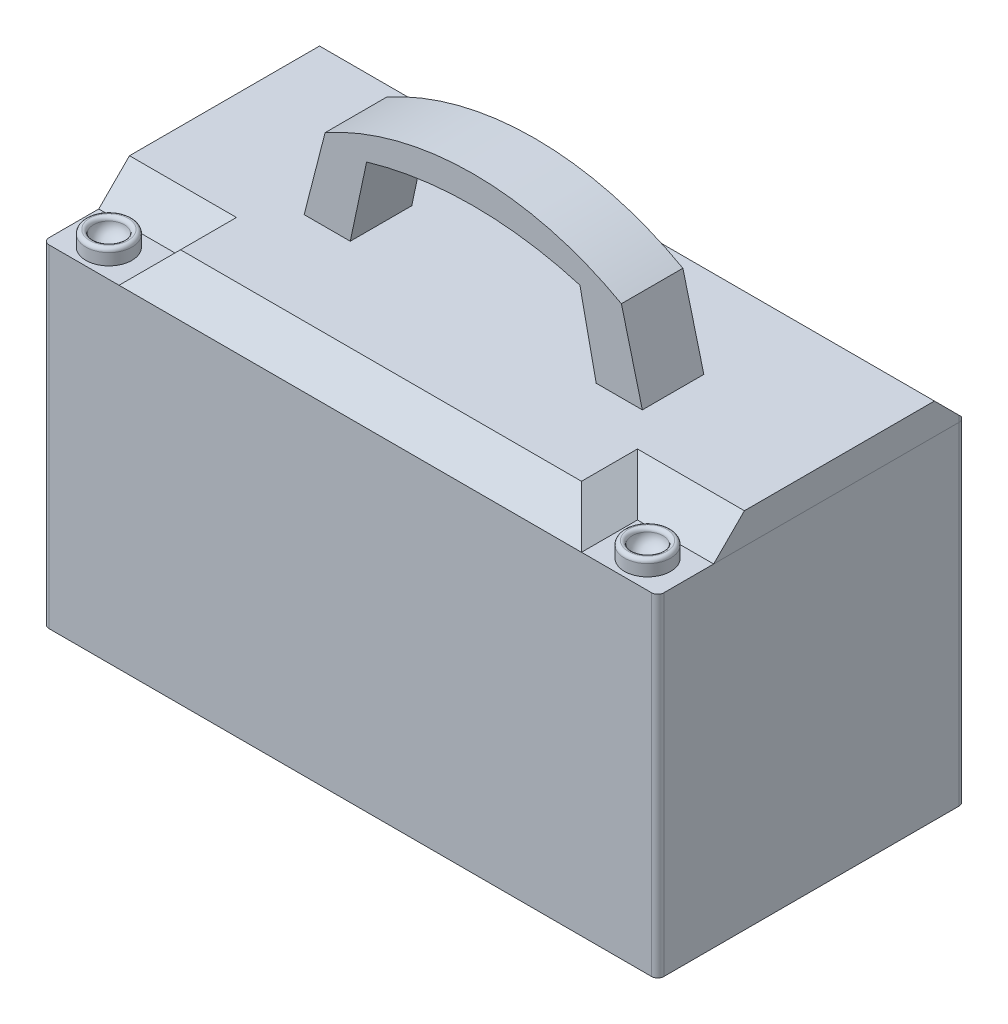
ISO-10303-21;
HEADER;
FILE_DESCRIPTION(('STEP AP214'),'2;1');
FILE_NAME('part.step','',(''),(''),'','','');
FILE_SCHEMA(('AUTOMOTIVE_DESIGN { 1 0 10303 214 1 1 1 1 }'));
ENDSEC;
DATA;
#1=APPLICATION_CONTEXT('core data for automotive mechanical design processes');
#2=APPLICATION_PROTOCOL_DEFINITION('international standard','automotive_design',2000,#1);
#3=PRODUCT_CONTEXT('',#1,'mechanical');
#4=PRODUCT('Part','Part','',(#3));
#5=PRODUCT_RELATED_PRODUCT_CATEGORY('part','',(#4));
#6=PRODUCT_DEFINITION_FORMATION('','',#4);
#7=PRODUCT_DEFINITION_CONTEXT('part definition',#1,'design');
#8=PRODUCT_DEFINITION('design','',#6,#7);
#9=PRODUCT_DEFINITION_SHAPE('','',#8);
#10=(LENGTH_UNIT() NAMED_UNIT(*) SI_UNIT(.MILLI.,.METRE.));
#11=(NAMED_UNIT(*) PLANE_ANGLE_UNIT() SI_UNIT($,.RADIAN.));
#12=(NAMED_UNIT(*) SI_UNIT($,.STERADIAN.) SOLID_ANGLE_UNIT());
#13=UNCERTAINTY_MEASURE_WITH_UNIT(LENGTH_MEASURE(1.E-05),#10,'distance_accuracy_value','');
#14=(GEOMETRIC_REPRESENTATION_CONTEXT(3) GLOBAL_UNCERTAINTY_ASSIGNED_CONTEXT((#13)) GLOBAL_UNIT_ASSIGNED_CONTEXT((#10,
#11,#12)) REPRESENTATION_CONTEXT('',''));
#15=CARTESIAN_POINT('',(0.,0.,0.));
#16=DIRECTION('',(0.,0.,1.));
#17=DIRECTION('',(1.,0.,0.));
#18=AXIS2_PLACEMENT_3D('',#15,#16,#17);
#19=CARTESIAN_POINT('',(2.54,150.,-124.46));
#20=DIRECTION('',(0.,-1.,0.));
#21=DIRECTION('',(0.,0.,-1.));
#22=AXIS2_PLACEMENT_3D('',#19,#20,#21);
#23=CYLINDRICAL_SURFACE('',#22,2.54);
#24=CARTESIAN_POINT('',(2.54,139.84,-124.46));
#25=DIRECTION('',(0.,-0.707106781186545,0.70710678118655));
#26=DIRECTION('',(0.,-0.70710678118655,-0.707106781186545));
#27=AXIS2_PLACEMENT_3D('',#24,#25,#26);
#28=ELLIPSE('',#27,3.59210244842767,2.54);
#29=CARTESIAN_POINT('',(2.54,137.3,-127.));
#30=VERTEX_POINT('',#29);
#31=CARTESIAN_POINT('',(0.,139.84,-124.46));
#32=VERTEX_POINT('',#31);
#33=EDGE_CURVE('E373',#30,#32,#28,.F.);
#34=ORIENTED_EDGE('',*,*,#33,.F.);
#35=CARTESIAN_POINT('',(2.54,137.3,-124.46));
#36=DIRECTION('',(0.,-1.,0.));
#37=DIRECTION('',(1.,0.,0.));
#38=AXIS2_PLACEMENT_3D('',#35,#36,#37);
#39=CIRCLE('',#38,2.54);
#40=CARTESIAN_POINT('',(0.,137.3,-124.46));
#41=VERTEX_POINT('',#40);
#42=EDGE_CURVE('E12',#30,#41,#39,.F.);
#43=ORIENTED_EDGE('',*,*,#42,.T.);
#44=DIRECTION('',(0.,-1.,0.));
#45=VECTOR('',#44,1.);
#46=CARTESIAN_POINT('',(0.,150.,-124.46));
#47=LINE('',#46,#45);
#48=EDGE_CURVE('E357',#32,#41,#47,.T.);
#49=ORIENTED_EDGE('',*,*,#48,.F.);
#50=EDGE_LOOP('',(#34,#43,#49));
#51=FACE_BOUND('',#50,.T.);
#52=ADVANCED_FACE('F37',(#51),#23,.T.);
#53=CARTESIAN_POINT('',(0.,150.,0.));
#54=DIRECTION('',(1.,0.,0.));
#55=DIRECTION('',(0.,0.,-1.));
#56=AXIS2_PLACEMENT_3D('',#53,#54,#55);
#57=PLANE('',#56);
#58=DIRECTION('',(0.,0.,-1.));
#59=VECTOR('',#58,1.);
#60=CARTESIAN_POINT('',(0.,137.3,0.));
#61=LINE('',#60,#59);
#62=CARTESIAN_POINT('',(0.,137.3,-23.1067400654727));
#63=VERTEX_POINT('',#62);
#64=EDGE_CURVE('E46',#63,#41,#61,.T.);
#65=ORIENTED_EDGE('',*,*,#64,.F.);
#66=DIRECTION('',(0.,0.707106781186548,-0.707106781186547));
#67=VECTOR('',#66,1.);
#68=CARTESIAN_POINT('',(0.,150.,-35.8067400654727));
#69=LINE('',#68,#67);
#70=CARTESIAN_POINT('',(0.,150.,-35.8067400654727));
#71=VERTEX_POINT('',#70);
#72=EDGE_CURVE('E305',#63,#71,#69,.T.);
#73=ORIENTED_EDGE('',*,*,#72,.T.);
#74=DIRECTION('',(0.,0.,1.));
#75=VECTOR('',#74,1.);
#76=CARTESIAN_POINT('',(0.,150.,0.));
#77=LINE('',#76,#75);
#78=CARTESIAN_POINT('',(0.,150.,-114.3));
#79=VERTEX_POINT('',#78);
#80=EDGE_CURVE('E260',#79,#71,#77,.T.);
#81=ORIENTED_EDGE('',*,*,#80,.F.);
#82=DIRECTION('',(0.,0.70710678118655,0.707106781186545));
#83=VECTOR('',#82,1.);
#84=CARTESIAN_POINT('',(0.,150.,-114.3));
#85=LINE('',#84,#83);
#86=EDGE_CURVE('E307',#79,#32,#85,.F.);
#87=ORIENTED_EDGE('',*,*,#86,.T.);
#88=ORIENTED_EDGE('',*,*,#48,.T.);
#89=EDGE_LOOP('',(#65,#73,#81,#87,#88));
#90=FACE_BOUND('',#89,.T.);
#91=ADVANCED_FACE('F402',(#90),#57,.F.);
#92=CARTESIAN_POINT('',(251.46,150.,-124.46));
#93=DIRECTION('',(0.,-1.,0.));
#94=DIRECTION('',(0.,0.,-1.));
#95=AXIS2_PLACEMENT_3D('',#92,#93,#94);
#96=CYLINDRICAL_SURFACE('',#95,2.54);
#97=DIRECTION('',(0.,-1.,0.));
#98=VECTOR('',#97,1.);
#99=CARTESIAN_POINT('',(254.,150.,-124.46));
#100=LINE('',#99,#98);
#101=CARTESIAN_POINT('',(254.,137.3,-124.46));
#102=VERTEX_POINT('',#101);
#103=CARTESIAN_POINT('',(254.,139.84,-124.46));
#104=VERTEX_POINT('',#103);
#105=EDGE_CURVE('E378',#102,#104,#100,.F.);
#106=ORIENTED_EDGE('',*,*,#105,.F.);
#107=CARTESIAN_POINT('',(251.46,137.3,-124.46));
#108=DIRECTION('',(0.,-1.,0.));
#109=DIRECTION('',(1.,0.,0.));
#110=AXIS2_PLACEMENT_3D('',#107,#108,#109);
#111=CIRCLE('',#110,2.54);
#112=CARTESIAN_POINT('',(251.46,137.3,-127.));
#113=VERTEX_POINT('',#112);
#114=EDGE_CURVE('E59',#102,#113,#111,.F.);
#115=ORIENTED_EDGE('',*,*,#114,.T.);
#116=CARTESIAN_POINT('',(251.46,139.84,-124.46));
#117=DIRECTION('',(0.,-0.707106781186545,0.70710678118655));
#118=DIRECTION('',(0.,-0.70710678118655,-0.707106781186545));
#119=AXIS2_PLACEMENT_3D('',#116,#117,#118);
#120=ELLIPSE('',#119,3.59210244842767,2.54);
#121=EDGE_CURVE('E370',#104,#113,#120,.F.);
#122=ORIENTED_EDGE('',*,*,#121,.F.);
#123=EDGE_LOOP('',(#106,#115,#122));
#124=FACE_BOUND('',#123,.T.);
#125=ADVANCED_FACE('F447',(#124),#96,.T.);
#126=CARTESIAN_POINT('',(254.,150.,0.));
#127=DIRECTION('',(-1.,0.,0.));
#128=DIRECTION('',(0.,0.,1.));
#129=AXIS2_PLACEMENT_3D('',#126,#127,#128);
#130=PLANE('',#129);
#131=DIRECTION('',(0.,0.,-1.));
#132=VECTOR('',#131,1.);
#133=CARTESIAN_POINT('',(254.,137.3,0.));
#134=LINE('',#133,#132);
#135=CARTESIAN_POINT('',(254.,137.3,-23.1067400654727));
#136=VERTEX_POINT('',#135);
#137=EDGE_CURVE('E384',#136,#102,#134,.T.);
#138=ORIENTED_EDGE('',*,*,#137,.F.);
#139=DIRECTION('',(0.,0.,-1.));
#140=VECTOR('',#139,1.);
#141=CARTESIAN_POINT('',(254.,137.3,0.));
#142=LINE('',#141,#140);
#143=CARTESIAN_POINT('',(254.,137.3,-2.54));
#144=VERTEX_POINT('',#143);
#145=EDGE_CURVE('E236',#144,#136,#142,.T.);
#146=ORIENTED_EDGE('',*,*,#145,.F.);
#147=DIRECTION('',(0.,-1.,0.));
#148=VECTOR('',#147,1.);
#149=CARTESIAN_POINT('',(254.,150.,-2.54));
#150=LINE('',#149,#148);
#151=CARTESIAN_POINT('',(254.,0.,-2.54));
#152=VERTEX_POINT('',#151);
#153=EDGE_CURVE('E375',#144,#152,#150,.T.);
#154=ORIENTED_EDGE('',*,*,#153,.T.);
#155=DIRECTION('',(0.,0.,-1.));
#156=VECTOR('',#155,1.);
#157=CARTESIAN_POINT('',(254.,0.,0.));
#158=LINE('',#157,#156);
#159=CARTESIAN_POINT('',(254.,0.,-124.46));
#160=VERTEX_POINT('',#159);
#161=EDGE_CURVE('E273',#152,#160,#158,.T.);
#162=ORIENTED_EDGE('',*,*,#161,.T.);
#163=EDGE_CURVE('E379',#160,#102,#100,.F.);
#164=ORIENTED_EDGE('',*,*,#163,.T.);
#165=EDGE_LOOP('',(#138,#146,#154,#162,#164));
#166=FACE_BOUND('',#165,.T.);
#167=ADVANCED_FACE('F419',(#166),#130,.F.);
#168=CARTESIAN_POINT('',(0.,150.,0.));
#169=DIRECTION('',(0.,-1.,0.));
#170=DIRECTION('',(0.,0.,-1.));
#171=AXIS2_PLACEMENT_3D('',#168,#169,#170);
#172=PLANE('',#171);
#173=DIRECTION('',(1.,0.,0.));
#174=VECTOR('',#173,1.);
#175=CARTESIAN_POINT('',(76.2,150.,-76.2));
#176=LINE('',#175,#174);
#177=CARTESIAN_POINT('',(57.15,150.,-76.2));
#178=VERTEX_POINT('',#177);
#179=CARTESIAN_POINT('',(76.2,150.,-76.2));
#180=VERTEX_POINT('',#179);
#181=EDGE_CURVE('E962',#178,#180,#176,.T.);
#182=ORIENTED_EDGE('',*,*,#181,.T.);
#183=DIRECTION('',(0.,0.,1.));
#184=VECTOR('',#183,1.);
#185=CARTESIAN_POINT('',(76.2,150.,-76.2));
#186=LINE('',#185,#184);
#187=CARTESIAN_POINT('',(76.2,150.,-50.8));
#188=VERTEX_POINT('',#187);
#189=EDGE_CURVE('E946',#180,#188,#186,.T.);
#190=ORIENTED_EDGE('',*,*,#189,.T.);
#191=DIRECTION('',(1.,0.,0.));
#192=VECTOR('',#191,1.);
#193=CARTESIAN_POINT('',(76.2,150.,-50.8));
#194=LINE('',#193,#192);
#195=CARTESIAN_POINT('',(57.15,150.,-50.8));
#196=VERTEX_POINT('',#195);
#197=EDGE_CURVE('E937',#196,#188,#194,.T.);
#198=ORIENTED_EDGE('',*,*,#197,.F.);
#199=DIRECTION('',(0.,0.,1.));
#200=VECTOR('',#199,1.);
#201=CARTESIAN_POINT('',(57.15,150.,-76.2));
#202=LINE('',#201,#200);
#203=EDGE_CURVE('E949',#178,#196,#202,.T.);
#204=ORIENTED_EDGE('',*,*,#203,.F.);
#205=EDGE_LOOP('',(#182,#190,#198,#204));
#206=FACE_BOUND('',#205,.T.);
#207=DIRECTION('',(0.,0.,-1.));
#208=VECTOR('',#207,1.);
#209=CARTESIAN_POINT('',(254.,150.,0.));
#210=LINE('',#209,#208);
#211=CARTESIAN_POINT('',(254.,150.,-35.8067400654727));
#212=VERTEX_POINT('',#211);
#213=CARTESIAN_POINT('',(254.,150.,-114.3));
#214=VERTEX_POINT('',#213);
#215=EDGE_CURVE('E263',#212,#214,#210,.T.);
#216=ORIENTED_EDGE('',*,*,#215,.T.);
#217=DIRECTION('',(-1.,0.,0.));
#218=VECTOR('',#217,1.);
#219=CARTESIAN_POINT('',(0.,150.,-114.3));
#220=LINE('',#219,#218);
#221=EDGE_CURVE('E302',#214,#79,#220,.T.);
#222=ORIENTED_EDGE('',*,*,#221,.T.);
#223=ORIENTED_EDGE('',*,*,#80,.T.);
#224=DIRECTION('',(1.,0.,0.));
#225=VECTOR('',#224,1.);
#226=CARTESIAN_POINT('',(31.4831745137974,150.,-35.8067400654727));
#227=LINE('',#226,#225);
#228=CARTESIAN_POINT('',(44.1831745137974,150.,-35.8067400654727));
#229=VERTEX_POINT('',#228);
#230=EDGE_CURVE('E299',#71,#229,#227,.T.);
#231=ORIENTED_EDGE('',*,*,#230,.T.);
#232=DIRECTION('',(0.,0.,1.));
#233=VECTOR('',#232,1.);
#234=CARTESIAN_POINT('',(44.1831745137974,150.,0.));
#235=LINE('',#234,#233);
#236=CARTESIAN_POINT('',(44.1831745137974,150.,-12.7));
#237=VERTEX_POINT('',#236);
#238=EDGE_CURVE('E297',#229,#237,#235,.T.);
#239=ORIENTED_EDGE('',*,*,#238,.T.);
#240=DIRECTION('',(1.,0.,0.));
#241=VECTOR('',#240,1.);
#242=CARTESIAN_POINT('',(0.,150.,-12.7));
#243=LINE('',#242,#241);
#244=CARTESIAN_POINT('',(209.816825486203,150.,-12.7));
#245=VERTEX_POINT('',#244);
#246=EDGE_CURVE('E288',#237,#245,#243,.T.);
#247=ORIENTED_EDGE('',*,*,#246,.T.);
#248=DIRECTION('',(0.,0.,-1.));
#249=VECTOR('',#248,1.);
#250=CARTESIAN_POINT('',(209.816825486203,150.,-23.1067400654727));
#251=LINE('',#250,#249);
#252=CARTESIAN_POINT('',(209.816825486203,150.,-35.8067400654727));
#253=VERTEX_POINT('',#252);
#254=EDGE_CURVE('E293',#245,#253,#251,.T.);
#255=ORIENTED_EDGE('',*,*,#254,.T.);
#256=DIRECTION('',(1.,0.,0.));
#257=VECTOR('',#256,1.);
#258=CARTESIAN_POINT('',(0.,150.,-35.8067400654727));
#259=LINE('',#258,#257);
#260=EDGE_CURVE('E295',#253,#212,#259,.T.);
#261=ORIENTED_EDGE('',*,*,#260,.T.);
#262=EDGE_LOOP('',(#216,#222,#223,#231,#239,#247,#255,#261));
#263=FACE_BOUND('',#262,.T.);
#264=DIRECTION('',(1.,0.,0.));
#265=VECTOR('',#264,1.);
#266=CARTESIAN_POINT('',(177.8,150.,-76.2));
#267=LINE('',#266,#265);
#268=CARTESIAN_POINT('',(177.8,150.,-76.2));
#269=VERTEX_POINT('',#268);
#270=CARTESIAN_POINT('',(196.85,150.,-76.2));
#271=VERTEX_POINT('',#270);
#272=EDGE_CURVE('E200',#269,#271,#267,.T.);
#273=ORIENTED_EDGE('',*,*,#272,.T.);
#274=DIRECTION('',(0.,0.,1.));
#275=VECTOR('',#274,1.);
#276=CARTESIAN_POINT('',(196.85,150.,-76.2));
#277=LINE('',#276,#275);
#278=CARTESIAN_POINT('',(196.85,150.,-50.8));
#279=VERTEX_POINT('',#278);
#280=EDGE_CURVE('E225',#271,#279,#277,.T.);
#281=ORIENTED_EDGE('',*,*,#280,.T.);
#282=DIRECTION('',(1.,0.,0.));
#283=VECTOR('',#282,1.);
#284=CARTESIAN_POINT('',(177.8,150.,-50.8));
#285=LINE('',#284,#283);
#286=CARTESIAN_POINT('',(177.8,150.,-50.8));
#287=VERTEX_POINT('',#286);
#288=EDGE_CURVE('E224',#287,#279,#285,.T.);
#289=ORIENTED_EDGE('',*,*,#288,.F.);
#290=DIRECTION('',(0.,0.,1.));
#291=VECTOR('',#290,1.);
#292=CARTESIAN_POINT('',(177.8,150.,-76.2));
#293=LINE('',#292,#291);
#294=EDGE_CURVE('E217',#269,#287,#293,.T.);
#295=ORIENTED_EDGE('',*,*,#294,.F.);
#296=EDGE_LOOP('',(#273,#281,#289,#295));
#297=FACE_BOUND('',#296,.T.);
#298=ADVANCED_FACE('F222',(#206,#263,#297),#172,.F.);
#299=CARTESIAN_POINT('',(0.,150.,0.));
#300=DIRECTION('',(0.,0.,-1.));
#301=DIRECTION('',(-1.,0.,0.));
#302=AXIS2_PLACEMENT_3D('',#299,#300,#301);
#303=PLANE('',#302);
#304=DIRECTION('',(1.,0.,0.));
#305=VECTOR('',#304,1.);
#306=CARTESIAN_POINT('',(0.,137.3,0.));
#307=LINE('',#306,#305);
#308=CARTESIAN_POINT('',(2.54,137.3,0.));
#309=VERTEX_POINT('',#308);
#310=CARTESIAN_POINT('',(31.4831745137974,137.3,0.));
#311=VERTEX_POINT('',#310);
#312=EDGE_CURVE('E254',#309,#311,#307,.T.);
#313=ORIENTED_EDGE('',*,*,#312,.F.);
#314=DIRECTION('',(0.,-1.,0.));
#315=VECTOR('',#314,1.);
#316=CARTESIAN_POINT('',(2.54,150.,0.));
#317=LINE('',#316,#315);
#318=CARTESIAN_POINT('',(2.54,0.,0.));
#319=VERTEX_POINT('',#318);
#320=EDGE_CURVE('E345',#309,#319,#317,.T.);
#321=ORIENTED_EDGE('',*,*,#320,.T.);
#322=DIRECTION('',(1.,0.,0.));
#323=VECTOR('',#322,1.);
#324=CARTESIAN_POINT('',(0.,0.,0.));
#325=LINE('',#324,#323);
#326=CARTESIAN_POINT('',(251.46,0.,0.));
#327=VERTEX_POINT('',#326);
#328=EDGE_CURVE('E270',#319,#327,#325,.T.);
#329=ORIENTED_EDGE('',*,*,#328,.T.);
#330=DIRECTION('',(0.,-1.,0.));
#331=VECTOR('',#330,1.);
#332=CARTESIAN_POINT('',(251.46,150.,0.));
#333=LINE('',#332,#331);
#334=CARTESIAN_POINT('',(251.46,137.3,0.));
#335=VERTEX_POINT('',#334);
#336=EDGE_CURVE('E343',#327,#335,#333,.F.);
#337=ORIENTED_EDGE('',*,*,#336,.T.);
#338=DIRECTION('',(-1.,0.,0.));
#339=VECTOR('',#338,1.);
#340=CARTESIAN_POINT('',(254.,137.3,0.));
#341=LINE('',#340,#339);
#342=CARTESIAN_POINT('',(222.516825486203,137.3,0.));
#343=VERTEX_POINT('',#342);
#344=EDGE_CURVE('E240',#335,#343,#341,.T.);
#345=ORIENTED_EDGE('',*,*,#344,.T.);
#346=DIRECTION('',(-1.,0.,0.));
#347=VECTOR('',#346,1.);
#348=CARTESIAN_POINT('',(0.,137.3,0.));
#349=LINE('',#348,#347);
#350=EDGE_CURVE('E318',#343,#311,#349,.T.);
#351=ORIENTED_EDGE('',*,*,#350,.T.);
#352=EDGE_LOOP('',(#313,#321,#329,#337,#345,#351));
#353=FACE_BOUND('',#352,.T.);
#354=ADVANCED_FACE('F427',(#353),#303,.F.);
#355=DIRECTION('',(0.,0.,-1.));
#356=VECTOR('',#355,1.);
#357=CARTESIAN_POINT('',(0.,137.3,0.));
#358=LINE('',#357,#356);
#359=CARTESIAN_POINT('',(0.,137.3,-2.54));
#360=VERTEX_POINT('',#359);
#361=EDGE_CURVE('E256',#360,#63,#358,.T.);
#362=ORIENTED_EDGE('',*,*,#361,.T.);
#363=ORIENTED_EDGE('',*,*,#64,.T.);
#364=CARTESIAN_POINT('',(0.,0.,-124.46));
#365=VERTEX_POINT('',#364);
#366=EDGE_CURVE('E356',#41,#365,#47,.T.);
#367=ORIENTED_EDGE('',*,*,#366,.T.);
#368=DIRECTION('',(0.,0.,1.));
#369=VECTOR('',#368,1.);
#370=CARTESIAN_POINT('',(0.,0.,0.));
#371=LINE('',#370,#369);
#372=CARTESIAN_POINT('',(0.,0.,-2.54));
#373=VERTEX_POINT('',#372);
#374=EDGE_CURVE('E259',#365,#373,#371,.T.);
#375=ORIENTED_EDGE('',*,*,#374,.T.);
#376=DIRECTION('',(0.,-1.,0.));
#377=VECTOR('',#376,1.);
#378=CARTESIAN_POINT('',(0.,150.,-2.54));
#379=LINE('',#378,#377);
#380=EDGE_CURVE('E360',#373,#360,#379,.F.);
#381=ORIENTED_EDGE('',*,*,#380,.T.);
#382=EDGE_LOOP('',(#362,#363,#367,#375,#381));
#383=FACE_BOUND('',#382,.T.);
#384=ADVANCED_FACE('F393',(#383),#57,.F.);
#385=DIRECTION('',(0.,0.707106781186548,-0.707106781186547));
#386=VECTOR('',#385,1.);
#387=CARTESIAN_POINT('',(254.,137.3,-23.1067400654727));
#388=LINE('',#387,#386);
#389=EDGE_CURVE('E313',#212,#136,#388,.F.);
#390=ORIENTED_EDGE('',*,*,#389,.T.);
#391=ORIENTED_EDGE('',*,*,#137,.T.);
#392=ORIENTED_EDGE('',*,*,#105,.T.);
#393=DIRECTION('',(0.,-0.70710678118655,-0.707106781186545));
#394=VECTOR('',#393,1.);
#395=CARTESIAN_POINT('',(254.,150.,-114.3));
#396=LINE('',#395,#394);
#397=EDGE_CURVE('E316',#104,#214,#396,.F.);
#398=ORIENTED_EDGE('',*,*,#397,.T.);
#399=ORIENTED_EDGE('',*,*,#215,.F.);
#400=EDGE_LOOP('',(#390,#391,#392,#398,#399));
#401=FACE_BOUND('',#400,.T.);
#402=ADVANCED_FACE('F448',(#401),#130,.F.);
#403=CARTESIAN_POINT('',(0.,150.,-127.));
#404=DIRECTION('',(0.,0.,1.));
#405=DIRECTION('',(1.,0.,0.));
#406=AXIS2_PLACEMENT_3D('',#403,#404,#405);
#407=PLANE('',#406);
#408=DIRECTION('',(-1.,0.,0.));
#409=VECTOR('',#408,1.);
#410=CARTESIAN_POINT('',(0.,0.,-127.));
#411=LINE('',#410,#409);
#412=CARTESIAN_POINT('',(251.46,0.,-127.));
#413=VERTEX_POINT('',#412);
#414=CARTESIAN_POINT('',(2.54,0.,-127.));
#415=VERTEX_POINT('',#414);
#416=EDGE_CURVE('E264',#413,#415,#411,.T.);
#417=ORIENTED_EDGE('',*,*,#416,.T.);
#418=DIRECTION('',(0.,-1.,0.));
#419=VECTOR('',#418,1.);
#420=CARTESIAN_POINT('',(2.54,150.,-127.));
#421=LINE('',#420,#419);
#422=EDGE_CURVE('E367',#415,#30,#421,.F.);
#423=ORIENTED_EDGE('',*,*,#422,.T.);
#424=DIRECTION('',(1.,0.,0.));
#425=VECTOR('',#424,1.);
#426=CARTESIAN_POINT('',(0.,137.3,-127.));
#427=LINE('',#426,#425);
#428=EDGE_CURVE('E310',#30,#113,#427,.T.);
#429=ORIENTED_EDGE('',*,*,#428,.T.);
#430=DIRECTION('',(0.,-1.,0.));
#431=VECTOR('',#430,1.);
#432=CARTESIAN_POINT('',(251.46,150.,-127.));
#433=LINE('',#432,#431);
#434=EDGE_CURVE('E364',#113,#413,#433,.T.);
#435=ORIENTED_EDGE('',*,*,#434,.T.);
#436=EDGE_LOOP('',(#417,#423,#429,#435));
#437=FACE_BOUND('',#436,.T.);
#438=ADVANCED_FACE('F411',(#437),#407,.F.);
#439=CARTESIAN_POINT('',(0.,0.,0.));
#440=DIRECTION('',(0.,-1.,0.));
#441=DIRECTION('',(0.,0.,-1.));
#442=AXIS2_PLACEMENT_3D('',#439,#440,#441);
#443=PLANE('',#442);
#444=ORIENTED_EDGE('',*,*,#328,.F.);
#445=CARTESIAN_POINT('',(2.54,0.,-2.54));
#446=DIRECTION('',(0.,-1.,0.));
#447=DIRECTION('',(0.,0.,-1.));
#448=AXIS2_PLACEMENT_3D('',#445,#446,#447);
#449=CIRCLE('',#448,2.54);
#450=EDGE_CURVE('E354',#319,#373,#449,.T.);
#451=ORIENTED_EDGE('',*,*,#450,.T.);
#452=ORIENTED_EDGE('',*,*,#374,.F.);
#453=CARTESIAN_POINT('',(2.54,0.,-124.46));
#454=DIRECTION('',(0.,-1.,0.));
#455=DIRECTION('',(0.,0.,-1.));
#456=AXIS2_PLACEMENT_3D('',#453,#454,#455);
#457=CIRCLE('',#456,2.54);
#458=EDGE_CURVE('E352',#365,#415,#457,.T.);
#459=ORIENTED_EDGE('',*,*,#458,.T.);
#460=ORIENTED_EDGE('',*,*,#416,.F.);
#461=CARTESIAN_POINT('',(251.46,0.,-124.46));
#462=DIRECTION('',(0.,-1.,0.));
#463=DIRECTION('',(0.,0.,-1.));
#464=AXIS2_PLACEMENT_3D('',#461,#462,#463);
#465=CIRCLE('',#464,2.54);
#466=EDGE_CURVE('E350',#413,#160,#465,.T.);
#467=ORIENTED_EDGE('',*,*,#466,.T.);
#468=ORIENTED_EDGE('',*,*,#161,.F.);
#469=CARTESIAN_POINT('',(251.46,0.,-2.54));
#470=DIRECTION('',(0.,-1.,0.));
#471=DIRECTION('',(0.,0.,-1.));
#472=AXIS2_PLACEMENT_3D('',#469,#470,#471);
#473=CIRCLE('',#472,2.54);
#474=EDGE_CURVE('E348',#152,#327,#473,.T.);
#475=ORIENTED_EDGE('',*,*,#474,.T.);
#476=EDGE_LOOP('',(#444,#451,#452,#459,#460,#467,#468,#475));
#477=FACE_BOUND('',#476,.T.);
#478=ADVANCED_FACE('F417',(#477),#443,.T.);
#479=CARTESIAN_POINT('',(0.,137.3,0.));
#480=DIRECTION('',(0.,1.,0.));
#481=DIRECTION('',(0.,0.,1.));
#482=AXIS2_PLACEMENT_3D('',#479,#480,#481);
#483=PLANE('',#482);
#484=CARTESIAN_POINT('',(15.7415872568987,137.3,-11.5533700327364));
#485=DIRECTION('',(0.,1.,0.));
#486=DIRECTION('',(0.,0.,1.));
#487=AXIS2_PLACEMENT_3D('',#484,#485,#486);
#488=CIRCLE('',#487,9.52500000000001);
#489=CARTESIAN_POINT('',(15.7415872568987,137.3,-2.02837003273636));
#490=VERTEX_POINT('',#489);
#491=EDGE_CURVE('E246',#490,#490,#488,.T.);
#492=ORIENTED_EDGE('',*,*,#491,.F.);
#493=EDGE_LOOP('',(#492));
#494=FACE_BOUND('',#493,.T.);
#495=ORIENTED_EDGE('',*,*,#361,.F.);
#496=CARTESIAN_POINT('',(2.54,137.3,-2.54));
#497=DIRECTION('',(0.,1.,0.));
#498=DIRECTION('',(0.,0.,1.));
#499=AXIS2_PLACEMENT_3D('',#496,#497,#498);
#500=CIRCLE('',#499,2.54);
#501=EDGE_CURVE('E362',#360,#309,#500,.T.);
#502=ORIENTED_EDGE('',*,*,#501,.T.);
#503=ORIENTED_EDGE('',*,*,#312,.T.);
#504=DIRECTION('',(0.,0.,-1.));
#505=VECTOR('',#504,1.);
#506=CARTESIAN_POINT('',(31.4831745137974,137.3,0.));
#507=LINE('',#506,#505);
#508=CARTESIAN_POINT('',(31.4831745137974,137.3,-23.1067400654727));
#509=VERTEX_POINT('',#508);
#510=EDGE_CURVE('E252',#311,#509,#507,.T.);
#511=ORIENTED_EDGE('',*,*,#510,.T.);
#512=DIRECTION('',(1.,0.,0.));
#513=VECTOR('',#512,1.);
#514=CARTESIAN_POINT('',(0.,137.3,-23.1067400654727));
#515=LINE('',#514,#513);
#516=EDGE_CURVE('E249',#63,#509,#515,.T.);
#517=ORIENTED_EDGE('',*,*,#516,.F.);
#518=EDGE_LOOP('',(#495,#502,#503,#511,#517));
#519=FACE_BOUND('',#518,.T.);
#520=ADVANCED_FACE('F435',(#494,#519),#483,.T.);
#521=CARTESIAN_POINT('',(15.7415872568987,143.65,-11.5533700327364));
#522=DIRECTION('',(0.,-1.,0.));
#523=DIRECTION('',(0.,0.,-1.));
#524=AXIS2_PLACEMENT_3D('',#521,#522,#523);
#525=CYLINDRICAL_SURFACE('',#524,9.52500000000001);
#526=CARTESIAN_POINT('',(15.7415872568987,142.0625,-11.5533700327364));
#527=DIRECTION('',(0.,1.,0.));
#528=DIRECTION('',(0.,0.,1.));
#529=AXIS2_PLACEMENT_3D('',#526,#527,#528);
#530=CIRCLE('',#529,9.52500000000001);
#531=CARTESIAN_POINT('',(15.7415872568987,142.0625,-2.02837003273636));
#532=VERTEX_POINT('',#531);
#533=EDGE_CURVE('E267',#532,#532,#530,.F.);
#534=ORIENTED_EDGE('',*,*,#533,.T.);
#535=EDGE_LOOP('',(#534));
#536=FACE_BOUND('',#535,.T.);
#537=ORIENTED_EDGE('',*,*,#491,.T.);
#538=EDGE_LOOP('',(#537));
#539=FACE_BOUND('',#538,.T.);
#540=ADVANCED_FACE('F833',(#536,#539),#525,.T.);
#541=CARTESIAN_POINT('',(15.7415872568987,137.3,-11.5533700327364));
#542=DIRECTION('',(0.,1.,0.));
#543=DIRECTION('',(0.,0.,1.));
#544=AXIS2_PLACEMENT_3D('',#541,#542,#543);
#545=CIRCLE('',#544,1.27756381411954);
#546=CARTESIAN_POINT('',(15.7415872568987,137.3,-10.2758062186168));
#547=VERTEX_POINT('',#546);
#548=EDGE_CURVE('E340',#547,#547,#545,.T.);
#549=ORIENTED_EDGE('',*,*,#548,.T.);
#550=EDGE_LOOP('',(#549));
#551=FACE_BOUND('',#550,.T.);
#552=ADVANCED_FACE('F634',(#551),#483,.T.);
#553=CARTESIAN_POINT('',(15.7415872568987,142.0625,-11.5533700327364));
#554=DIRECTION('',(0.,1.,0.));
#555=DIRECTION('',(0.,0.,1.));
#556=AXIS2_PLACEMENT_3D('',#553,#554,#555);
#557=TOROIDAL_SURFACE('',#556,7.93750000000001,1.5875);
#558=ORIENTED_EDGE('',*,*,#533,.F.);
#559=EDGE_LOOP('',(#558));
#560=FACE_BOUND('',#559,.T.);
#561=CARTESIAN_POINT('',(15.7415872568987,143.65,-11.5533700327364));
#562=DIRECTION('',(0.,1.,0.));
#563=DIRECTION('',(0.,0.,1.));
#564=AXIS2_PLACEMENT_3D('',#561,#562,#563);
#565=CIRCLE('',#564,7.93750000000001);
#566=CARTESIAN_POINT('',(15.7415872568987,143.65,-3.61587003273636));
#567=VERTEX_POINT('',#566);
#568=EDGE_CURVE('E245',#567,#567,#565,.T.);
#569=ORIENTED_EDGE('',*,*,#568,.F.);
#570=EDGE_LOOP('',(#569));
#571=FACE_BOUND('',#570,.T.);
#572=ADVANCED_FACE('F533',(#560,#571),#557,.T.);
#573=CARTESIAN_POINT('',(15.7415872568987,142.0625,-11.5533700327364));
#574=DIRECTION('',(0.,1.,0.));
#575=DIRECTION('',(0.,0.,1.));
#576=AXIS2_PLACEMENT_3D('',#573,#574,#575);
#577=TOROIDAL_SURFACE('',#576,7.9375,1.5875);
#578=CARTESIAN_POINT('',(15.7415872568987,142.138095238095,-11.5533700327364));
#579=DIRECTION('',(0.,-1.,0.));
#580=DIRECTION('',(0.,0.,-1.));
#581=AXIS2_PLACEMENT_3D('',#578,#579,#580);
#582=CIRCLE('',#581,6.3518009081237);
#583=CARTESIAN_POINT('',(15.7415872568987,142.138095238095,-17.9051709408601));
#584=VERTEX_POINT('',#583);
#585=EDGE_CURVE('E337',#584,#584,#582,.T.);
#586=ORIENTED_EDGE('',*,*,#585,.T.);
#587=EDGE_LOOP('',(#586));
#588=FACE_BOUND('',#587,.T.);
#589=ORIENTED_EDGE('',*,*,#568,.T.);
#590=EDGE_LOOP('',(#589));
#591=FACE_BOUND('',#590,.T.);
#592=ADVANCED_FACE('F528',(#588,#591),#577,.T.);
#593=CARTESIAN_POINT('',(254.,137.3,0.));
#594=DIRECTION('',(0.,1.,0.));
#595=DIRECTION('',(0.,0.,1.));
#596=AXIS2_PLACEMENT_3D('',#593,#594,#595);
#597=PLANE('',#596);
#598=CARTESIAN_POINT('',(238.258412743101,137.3,-11.5533700327364));
#599=DIRECTION('',(0.,1.,0.));
#600=DIRECTION('',(0.,0.,1.));
#601=AXIS2_PLACEMENT_3D('',#598,#599,#600);
#602=CIRCLE('',#601,9.52500000000001);
#603=CARTESIAN_POINT('',(238.258412743101,137.3,-2.02837003273636));
#604=VERTEX_POINT('',#603);
#605=EDGE_CURVE('E280',#604,#604,#602,.T.);
#606=ORIENTED_EDGE('',*,*,#605,.F.);
#607=EDGE_LOOP('',(#606));
#608=FACE_BOUND('',#607,.T.);
#609=ORIENTED_EDGE('',*,*,#344,.F.);
#610=CARTESIAN_POINT('',(251.46,137.3,-2.54));
#611=DIRECTION('',(0.,1.,0.));
#612=DIRECTION('',(0.,0.,1.));
#613=AXIS2_PLACEMENT_3D('',#610,#611,#612);
#614=CIRCLE('',#613,2.54);
#615=EDGE_CURVE('E382',#335,#144,#614,.T.);
#616=ORIENTED_EDGE('',*,*,#615,.T.);
#617=ORIENTED_EDGE('',*,*,#145,.T.);
#618=DIRECTION('',(-1.,0.,0.));
#619=VECTOR('',#618,1.);
#620=CARTESIAN_POINT('',(254.,137.3,-23.1067400654727));
#621=LINE('',#620,#619);
#622=CARTESIAN_POINT('',(222.516825486203,137.3,-23.1067400654727));
#623=VERTEX_POINT('',#622);
#624=EDGE_CURVE('E234',#136,#623,#621,.T.);
#625=ORIENTED_EDGE('',*,*,#624,.T.);
#626=DIRECTION('',(0.,0.,-1.));
#627=VECTOR('',#626,1.);
#628=CARTESIAN_POINT('',(222.516825486203,137.3,0.));
#629=LINE('',#628,#627);
#630=EDGE_CURVE('E242',#343,#623,#629,.T.);
#631=ORIENTED_EDGE('',*,*,#630,.F.);
#632=EDGE_LOOP('',(#609,#616,#617,#625,#631));
#633=FACE_BOUND('',#632,.T.);
#634=ADVANCED_FACE('F452',(#608,#633),#597,.T.);
#635=CARTESIAN_POINT('',(238.258412743101,143.65,-11.5533700327364));
#636=DIRECTION('',(0.,-1.,0.));
#637=DIRECTION('',(0.,0.,-1.));
#638=AXIS2_PLACEMENT_3D('',#635,#636,#637);
#639=CYLINDRICAL_SURFACE('',#638,9.52500000000001);
#640=CARTESIAN_POINT('',(238.258412743101,142.0625,-11.5533700327364));
#641=DIRECTION('',(0.,1.,0.));
#642=DIRECTION('',(0.,0.,1.));
#643=AXIS2_PLACEMENT_3D('',#640,#641,#642);
#644=CIRCLE('',#643,9.52500000000001);
#645=CARTESIAN_POINT('',(238.258412743101,142.0625,-2.02837003273636));
#646=VERTEX_POINT('',#645);
#647=EDGE_CURVE('E285',#646,#646,#644,.F.);
#648=ORIENTED_EDGE('',*,*,#647,.T.);
#649=EDGE_LOOP('',(#648));
#650=FACE_BOUND('',#649,.T.);
#651=ORIENTED_EDGE('',*,*,#605,.T.);
#652=EDGE_LOOP('',(#651));
#653=FACE_BOUND('',#652,.T.);
#654=ADVANCED_FACE('F521',(#650,#653),#639,.T.);
#655=CARTESIAN_POINT('',(238.258412743101,137.3,-11.5533700327364));
#656=DIRECTION('',(0.,1.,0.));
#657=DIRECTION('',(0.,0.,1.));
#658=AXIS2_PLACEMENT_3D('',#655,#656,#657);
#659=CIRCLE('',#658,1.27756381411954);
#660=CARTESIAN_POINT('',(238.258412743101,137.3,-10.2758062186168));
#661=VERTEX_POINT('',#660);
#662=EDGE_CURVE('E334',#661,#661,#659,.T.);
#663=ORIENTED_EDGE('',*,*,#662,.T.);
#664=EDGE_LOOP('',(#663));
#665=FACE_BOUND('',#664,.T.);
#666=ADVANCED_FACE('F512',(#665),#597,.T.);
#667=CARTESIAN_POINT('',(238.258412743101,142.0625,-11.5533700327364));
#668=DIRECTION('',(0.,1.,0.));
#669=DIRECTION('',(0.,0.,1.));
#670=AXIS2_PLACEMENT_3D('',#667,#668,#669);
#671=TOROIDAL_SURFACE('',#670,7.9375,1.5875);
#672=CARTESIAN_POINT('',(238.258412743101,142.138095238095,-11.5533700327364));
#673=DIRECTION('',(0.,-1.,0.));
#674=DIRECTION('',(0.,0.,-1.));
#675=AXIS2_PLACEMENT_3D('',#672,#673,#674);
#676=CIRCLE('',#675,6.3518009081237);
#677=CARTESIAN_POINT('',(238.258412743101,142.138095238095,-17.9051709408601));
#678=VERTEX_POINT('',#677);
#679=EDGE_CURVE('E321',#678,#678,#676,.T.);
#680=ORIENTED_EDGE('',*,*,#679,.T.);
#681=EDGE_LOOP('',(#680));
#682=FACE_BOUND('',#681,.T.);
#683=CARTESIAN_POINT('',(238.258412743101,143.65,-11.5533700327364));
#684=DIRECTION('',(0.,1.,0.));
#685=DIRECTION('',(0.,0.,1.));
#686=AXIS2_PLACEMENT_3D('',#683,#684,#685);
#687=CIRCLE('',#686,7.9375);
#688=CARTESIAN_POINT('',(238.258412743101,143.65,-3.61587003273637));
#689=VERTEX_POINT('',#688);
#690=EDGE_CURVE('E237',#689,#689,#687,.F.);
#691=ORIENTED_EDGE('',*,*,#690,.F.);
#692=EDGE_LOOP('',(#691));
#693=FACE_BOUND('',#692,.T.);
#694=ADVANCED_FACE('F509',(#682,#693),#671,.T.);
#695=CARTESIAN_POINT('',(238.258412743101,142.0625,-11.5533700327364));
#696=DIRECTION('',(0.,1.,0.));
#697=DIRECTION('',(0.,0.,1.));
#698=AXIS2_PLACEMENT_3D('',#695,#696,#697);
#699=TOROIDAL_SURFACE('',#698,7.93750000000001,1.5875);
#700=ORIENTED_EDGE('',*,*,#690,.T.);
#701=EDGE_LOOP('',(#700));
#702=FACE_BOUND('',#701,.T.);
#703=ORIENTED_EDGE('',*,*,#647,.F.);
#704=EDGE_LOOP('',(#703));
#705=FACE_BOUND('',#704,.T.);
#706=ADVANCED_FACE('F477',(#702,#705),#699,.T.);
#707=CARTESIAN_POINT('',(0.,150.,-114.3));
#708=DIRECTION('',(0.,-0.707106781186545,0.70710678118655));
#709=DIRECTION('',(-1.,0.,0.));
#710=AXIS2_PLACEMENT_3D('',#707,#708,#709);
#711=PLANE('',#710);
#712=ORIENTED_EDGE('',*,*,#428,.F.);
#713=ORIENTED_EDGE('',*,*,#33,.T.);
#714=ORIENTED_EDGE('',*,*,#86,.F.);
#715=ORIENTED_EDGE('',*,*,#221,.F.);
#716=ORIENTED_EDGE('',*,*,#397,.F.);
#717=ORIENTED_EDGE('',*,*,#121,.T.);
#718=EDGE_LOOP('',(#712,#713,#714,#715,#716,#717));
#719=FACE_BOUND('',#718,.T.);
#720=ADVANCED_FACE('F406',(#719),#711,.F.);
#721=CARTESIAN_POINT('',(254.,137.3,-23.1067400654727));
#722=DIRECTION('',(0.,-0.707106781186547,-0.707106781186548));
#723=DIRECTION('',(-1.,0.,0.));
#724=AXIS2_PLACEMENT_3D('',#721,#722,#723);
#725=PLANE('',#724);
#726=ORIENTED_EDGE('',*,*,#389,.F.);
#727=ORIENTED_EDGE('',*,*,#260,.F.);
#728=DIRECTION('',(0.577350269189625,-0.577350269189627,0.577350269189625));
#729=VECTOR('',#728,1.);
#730=CARTESIAN_POINT('',(233.011216990802,126.805608495401,-12.6123485608736));
#731=LINE('',#730,#729);
#732=EDGE_CURVE('E291',#623,#253,#731,.F.);
#733=ORIENTED_EDGE('',*,*,#732,.F.);
#734=ORIENTED_EDGE('',*,*,#624,.F.);
#735=EDGE_LOOP('',(#726,#727,#733,#734));
#736=FACE_BOUND('',#735,.T.);
#737=ADVANCED_FACE('F469',(#736),#725,.F.);
#738=CARTESIAN_POINT('',(209.816825486203,150.,0.));
#739=DIRECTION('',(0.707106781186548,0.707106781186547,0.));
#740=DIRECTION('',(0.,0.,1.));
#741=AXIS2_PLACEMENT_3D('',#738,#739,#740);
#742=PLANE('',#741);
#743=ORIENTED_EDGE('',*,*,#732,.T.);
#744=ORIENTED_EDGE('',*,*,#254,.F.);
#745=DIRECTION('',(0.577350269189625,-0.577350269189627,0.577350269189625));
#746=VECTOR('',#745,1.);
#747=CARTESIAN_POINT('',(139.877883657469,219.938941828734,-82.6389418287341));
#748=LINE('',#747,#746);
#749=EDGE_CURVE('E327',#343,#245,#748,.F.);
#750=ORIENTED_EDGE('',*,*,#749,.F.);
#751=ORIENTED_EDGE('',*,*,#630,.T.);
#752=EDGE_LOOP('',(#743,#744,#750,#751));
#753=FACE_BOUND('',#752,.T.);
#754=ADVANCED_FACE('F467',(#753),#742,.T.);
#755=CARTESIAN_POINT('',(0.,150.,-12.7));
#756=DIRECTION('',(0.,-0.707106781186547,-0.707106781186548));
#757=DIRECTION('',(1.,0.,0.));
#758=AXIS2_PLACEMENT_3D('',#755,#756,#757);
#759=PLANE('',#758);
#760=ORIENTED_EDGE('',*,*,#749,.T.);
#761=ORIENTED_EDGE('',*,*,#246,.F.);
#762=DIRECTION('',(-0.577350269189625,-0.577350269189627,0.577350269189625));
#763=VECTOR('',#762,1.);
#764=CARTESIAN_POINT('',(29.4554496758649,135.272275162068,2.02772483793245));
#765=LINE('',#764,#763);
#766=EDGE_CURVE('E324',#311,#237,#765,.F.);
#767=ORIENTED_EDGE('',*,*,#766,.F.);
#768=ORIENTED_EDGE('',*,*,#350,.F.);
#769=EDGE_LOOP('',(#760,#761,#767,#768));
#770=FACE_BOUND('',#769,.T.);
#771=ADVANCED_FACE('F460',(#770),#759,.F.);
#772=CARTESIAN_POINT('',(31.4831745137974,137.3,0.));
#773=DIRECTION('',(0.707106781186548,-0.707106781186547,0.));
#774=DIRECTION('',(0.,0.,-1.));
#775=AXIS2_PLACEMENT_3D('',#772,#773,#774);
#776=PLANE('',#775);
#777=ORIENTED_EDGE('',*,*,#766,.T.);
#778=ORIENTED_EDGE('',*,*,#238,.F.);
#779=DIRECTION('',(0.577350269189625,0.577350269189627,-0.577350269189625));
#780=VECTOR('',#779,1.);
#781=CARTESIAN_POINT('',(29.4554496758649,135.272275162068,-21.0790152275403));
#782=LINE('',#781,#780);
#783=EDGE_CURVE('E322',#509,#229,#782,.T.);
#784=ORIENTED_EDGE('',*,*,#783,.F.);
#785=ORIENTED_EDGE('',*,*,#510,.F.);
#786=EDGE_LOOP('',(#777,#778,#784,#785));
#787=FACE_BOUND('',#786,.T.);
#788=ADVANCED_FACE('F463',(#787),#776,.F.);
#789=CARTESIAN_POINT('',(0.,150.,-35.8067400654727));
#790=DIRECTION('',(0.,0.707106781186547,0.707106781186548));
#791=DIRECTION('',(-1.,0.,0.));
#792=AXIS2_PLACEMENT_3D('',#789,#790,#791);
#793=PLANE('',#792);
#794=ORIENTED_EDGE('',*,*,#72,.F.);
#795=ORIENTED_EDGE('',*,*,#516,.T.);
#796=ORIENTED_EDGE('',*,*,#783,.T.);
#797=ORIENTED_EDGE('',*,*,#230,.F.);
#798=EDGE_LOOP('',(#794,#795,#796,#797));
#799=FACE_BOUND('',#798,.T.);
#800=ADVANCED_FACE('F441',(#799),#793,.T.);
#801=CARTESIAN_POINT('',(238.258412743101,142.38,-11.5533700327364));
#802=DIRECTION('',(0.,-1.,0.));
#803=DIRECTION('',(0.,0.,-1.));
#804=AXIS2_PLACEMENT_3D('',#801,#802,#803);
#805=DEGENERATE_TOROIDAL_SURFACE('',#804,1.27756381411954,5.08,.T.);
#806=ORIENTED_EDGE('',*,*,#662,.F.);
#807=EDGE_LOOP('',(#806));
#808=FACE_BOUND('',#807,.T.);
#809=ORIENTED_EDGE('',*,*,#679,.F.);
#810=EDGE_LOOP('',(#809));
#811=FACE_BOUND('',#810,.T.);
#812=ADVANCED_FACE('F496',(#808,#811),#805,.F.);
#813=CARTESIAN_POINT('',(15.7415872568987,142.38,-11.5533700327364));
#814=DIRECTION('',(0.,-1.,0.));
#815=DIRECTION('',(0.,0.,-1.));
#816=AXIS2_PLACEMENT_3D('',#813,#814,#815);
#817=DEGENERATE_TOROIDAL_SURFACE('',#816,1.27756381411954,5.08,.T.);
#818=ORIENTED_EDGE('',*,*,#548,.F.);
#819=EDGE_LOOP('',(#818));
#820=FACE_BOUND('',#819,.T.);
#821=ORIENTED_EDGE('',*,*,#585,.F.);
#822=EDGE_LOOP('',(#821));
#823=FACE_BOUND('',#822,.T.);
#824=ADVANCED_FACE('F492',(#820,#823),#817,.F.);
#825=CARTESIAN_POINT('',(2.54,150.,-2.54));
#826=DIRECTION('',(0.,-1.,0.));
#827=DIRECTION('',(0.,0.,-1.));
#828=AXIS2_PLACEMENT_3D('',#825,#826,#827);
#829=CYLINDRICAL_SURFACE('',#828,2.54);
#830=ORIENTED_EDGE('',*,*,#501,.F.);
#831=ORIENTED_EDGE('',*,*,#380,.F.);
#832=ORIENTED_EDGE('',*,*,#450,.F.);
#833=ORIENTED_EDGE('',*,*,#320,.F.);
#834=EDGE_LOOP('',(#830,#831,#832,#833));
#835=FACE_BOUND('',#834,.T.);
#836=ADVANCED_FACE('F432',(#835),#829,.T.);
#837=ORIENTED_EDGE('',*,*,#42,.F.);
#838=ORIENTED_EDGE('',*,*,#422,.F.);
#839=ORIENTED_EDGE('',*,*,#458,.F.);
#840=ORIENTED_EDGE('',*,*,#366,.F.);
#841=EDGE_LOOP('',(#837,#838,#839,#840));
#842=FACE_BOUND('',#841,.T.);
#843=ADVANCED_FACE('F399',(#842),#23,.T.);
#844=ORIENTED_EDGE('',*,*,#114,.F.);
#845=ORIENTED_EDGE('',*,*,#163,.F.);
#846=ORIENTED_EDGE('',*,*,#466,.F.);
#847=ORIENTED_EDGE('',*,*,#434,.F.);
#848=EDGE_LOOP('',(#844,#845,#846,#847));
#849=FACE_BOUND('',#848,.T.);
#850=ADVANCED_FACE('F413',(#849),#96,.T.);
#851=CARTESIAN_POINT('',(251.46,150.,-2.54));
#852=DIRECTION('',(0.,-1.,0.));
#853=DIRECTION('',(0.,0.,-1.));
#854=AXIS2_PLACEMENT_3D('',#851,#852,#853);
#855=CYLINDRICAL_SURFACE('',#854,2.54);
#856=ORIENTED_EDGE('',*,*,#615,.F.);
#857=ORIENTED_EDGE('',*,*,#336,.F.);
#858=ORIENTED_EDGE('',*,*,#474,.F.);
#859=ORIENTED_EDGE('',*,*,#153,.F.);
#860=EDGE_LOOP('',(#856,#857,#858,#859));
#861=FACE_BOUND('',#860,.T.);
#862=ADVANCED_FACE('F39',(#861),#855,.T.);
#863=CARTESIAN_POINT('',(177.8,150.,-76.2));
#864=DIRECTION('',(-0.978147600733805,-0.207911690817763,0.));
#865=DIRECTION('',(0.207911690817763,-0.978147600733805,0.));
#866=AXIS2_PLACEMENT_3D('',#863,#864,#865);
#867=PLANE('',#866);
#868=DIRECTION('',(0.207911690817763,-0.978147600733805,0.));
#869=VECTOR('',#868,1.);
#870=CARTESIAN_POINT('',(177.8,150.,-50.8));
#871=LINE('',#870,#869);
#872=CARTESIAN_POINT('',(171.051329166977,181.75,-50.8));
#873=VERTEX_POINT('',#872);
#874=EDGE_CURVE('E922',#873,#287,#871,.T.);
#875=ORIENTED_EDGE('',*,*,#874,.F.);
#876=DIRECTION('',(0.,0.,1.));
#877=VECTOR('',#876,1.);
#878=CARTESIAN_POINT('',(171.051329166977,181.75,-76.2));
#879=LINE('',#878,#877);
#880=CARTESIAN_POINT('',(171.051329166977,181.75,-76.2));
#881=VERTEX_POINT('',#880);
#882=EDGE_CURVE('E219',#881,#873,#879,.T.);
#883=ORIENTED_EDGE('',*,*,#882,.F.);
#884=DIRECTION('',(0.207911690817763,-0.978147600733805,0.));
#885=VECTOR('',#884,1.);
#886=CARTESIAN_POINT('',(177.8,150.,-76.2));
#887=LINE('',#886,#885);
#888=EDGE_CURVE('E204',#881,#269,#887,.T.);
#889=ORIENTED_EDGE('',*,*,#888,.T.);
#890=ORIENTED_EDGE('',*,*,#294,.T.);
#891=EDGE_LOOP('',(#875,#883,#889,#890));
#892=FACE_BOUND('',#891,.T.);
#893=ADVANCED_FACE('F216',(#892),#867,.T.);
#894=CARTESIAN_POINT('',(127.,32.1281809939102,-76.2));
#895=DIRECTION('',(0.,0.,1.));
#896=DIRECTION('',(1.,0.,0.));
#897=AXIS2_PLACEMENT_3D('',#894,#895,#896);
#898=CYLINDRICAL_SURFACE('',#897,155.97181900609);
#899=CARTESIAN_POINT('',(127.,32.1281809939102,-50.8));
#900=DIRECTION('',(0.,0.,-1.));
#901=DIRECTION('',(1.,0.,0.));
#902=AXIS2_PLACEMENT_3D('',#899,#900,#901);
#903=CIRCLE('',#902,155.97181900609);
#904=CARTESIAN_POINT('',(82.9486708330233,181.75,-50.8));
#905=VERTEX_POINT('',#904);
#906=EDGE_CURVE('E220',#905,#873,#903,.T.);
#907=ORIENTED_EDGE('',*,*,#906,.F.);
#908=DIRECTION('',(0.,0.,1.));
#909=VECTOR('',#908,1.);
#910=CARTESIAN_POINT('',(82.9486708330233,181.75,-76.2));
#911=LINE('',#910,#909);
#912=CARTESIAN_POINT('',(82.9486708330233,181.75,-76.2));
#913=VERTEX_POINT('',#912);
#914=EDGE_CURVE('E944',#913,#905,#911,.T.);
#915=ORIENTED_EDGE('',*,*,#914,.F.);
#916=CARTESIAN_POINT('',(127.,32.1281809939102,-76.2));
#917=DIRECTION('',(0.,0.,-1.));
#918=DIRECTION('',(1.,0.,0.));
#919=AXIS2_PLACEMENT_3D('',#916,#917,#918);
#920=CIRCLE('',#919,155.97181900609);
#921=EDGE_CURVE('E226',#913,#881,#920,.T.);
#922=ORIENTED_EDGE('',*,*,#921,.T.);
#923=ORIENTED_EDGE('',*,*,#882,.T.);
#924=EDGE_LOOP('',(#907,#915,#922,#923));
#925=FACE_BOUND('',#924,.T.);
#926=ADVANCED_FACE('F704',(#925),#898,.F.);
#927=CARTESIAN_POINT('',(76.2,150.,-76.2));
#928=DIRECTION('',(0.978147600733805,-0.207911690817763,0.));
#929=DIRECTION('',(0.207911690817763,0.978147600733805,0.));
#930=AXIS2_PLACEMENT_3D('',#927,#928,#929);
#931=PLANE('',#930);
#932=DIRECTION('',(0.207911690817763,0.978147600733805,0.));
#933=VECTOR('',#932,1.);
#934=CARTESIAN_POINT('',(76.2,150.,-50.8));
#935=LINE('',#934,#933);
#936=EDGE_CURVE('E940',#188,#905,#935,.T.);
#937=ORIENTED_EDGE('',*,*,#936,.F.);
#938=ORIENTED_EDGE('',*,*,#189,.F.);
#939=DIRECTION('',(0.207911690817763,0.978147600733805,0.));
#940=VECTOR('',#939,1.);
#941=CARTESIAN_POINT('',(76.2,150.,-76.2));
#942=LINE('',#941,#940);
#943=EDGE_CURVE('E230',#180,#913,#942,.T.);
#944=ORIENTED_EDGE('',*,*,#943,.T.);
#945=ORIENTED_EDGE('',*,*,#914,.T.);
#946=EDGE_LOOP('',(#937,#938,#944,#945));
#947=FACE_BOUND('',#946,.T.);
#948=ADVANCED_FACE('F712',(#947),#931,.T.);
#949=CARTESIAN_POINT('',(57.15,150.,-76.2));
#950=DIRECTION('',(-0.968496208784646,0.249028298732829,0.));
#951=DIRECTION('',(-0.249028298732829,-0.968496208784646,0.));
#952=AXIS2_PLACEMENT_3D('',#949,#950,#951);
#953=PLANE('',#952);
#954=DIRECTION('',(-0.249028298732829,-0.968496208784646,0.));
#955=VECTOR('',#954,1.);
#956=CARTESIAN_POINT('',(57.15,150.,-50.8));
#957=LINE('',#956,#955);
#958=CARTESIAN_POINT('',(65.8036708330233,183.655,-50.8));
#959=VERTEX_POINT('',#958);
#960=EDGE_CURVE('E935',#959,#196,#957,.T.);
#961=ORIENTED_EDGE('',*,*,#960,.F.);
#962=DIRECTION('',(0.,0.,1.));
#963=VECTOR('',#962,1.);
#964=CARTESIAN_POINT('',(65.8036708330233,183.655,-76.2));
#965=LINE('',#964,#963);
#966=CARTESIAN_POINT('',(65.8036708330233,183.655,-76.2));
#967=VERTEX_POINT('',#966);
#968=EDGE_CURVE('E952',#967,#959,#965,.T.);
#969=ORIENTED_EDGE('',*,*,#968,.F.);
#970=DIRECTION('',(-0.249028298732829,-0.968496208784646,0.));
#971=VECTOR('',#970,1.);
#972=CARTESIAN_POINT('',(57.15,150.,-76.2));
#973=LINE('',#972,#971);
#974=EDGE_CURVE('E960',#967,#178,#973,.T.);
#975=ORIENTED_EDGE('',*,*,#974,.T.);
#976=ORIENTED_EDGE('',*,*,#203,.T.);
#977=EDGE_LOOP('',(#961,#969,#975,#976));
#978=FACE_BOUND('',#977,.T.);
#979=ADVANCED_FACE('F721',(#978),#953,.T.);
#980=CARTESIAN_POINT('',(127.,73.6400368972292,-76.2));
#981=DIRECTION('',(0.,0.,1.));
#982=DIRECTION('',(1.,0.,0.));
#983=AXIS2_PLACEMENT_3D('',#980,#981,#982);
#984=CYLINDRICAL_SURFACE('',#983,125.889963102771);
#985=CARTESIAN_POINT('',(127.,73.6400368972292,-50.8));
#986=DIRECTION('',(0.,0.,1.));
#987=DIRECTION('',(1.,0.,0.));
#988=AXIS2_PLACEMENT_3D('',#985,#986,#987);
#989=CIRCLE('',#988,125.889963102771);
#990=CARTESIAN_POINT('',(188.196329166977,183.655,-50.8));
#991=VERTEX_POINT('',#990);
#992=EDGE_CURVE('E932',#991,#959,#989,.T.);
#993=ORIENTED_EDGE('',*,*,#992,.F.);
#994=DIRECTION('',(0.,0.,1.));
#995=VECTOR('',#994,1.);
#996=CARTESIAN_POINT('',(188.196329166977,183.655,-76.2));
#997=LINE('',#996,#995);
#998=CARTESIAN_POINT('',(188.196329166977,183.655,-76.2));
#999=VERTEX_POINT('',#998);
#1000=EDGE_CURVE('E228',#999,#991,#997,.T.);
#1001=ORIENTED_EDGE('',*,*,#1000,.F.);
#1002=CARTESIAN_POINT('',(127.,73.6400368972292,-76.2));
#1003=DIRECTION('',(0.,0.,1.));
#1004=DIRECTION('',(1.,0.,0.));
#1005=AXIS2_PLACEMENT_3D('',#1002,#1003,#1004);
#1006=CIRCLE('',#1005,125.889963102771);
#1007=EDGE_CURVE('E968',#999,#967,#1006,.T.);
#1008=ORIENTED_EDGE('',*,*,#1007,.T.);
#1009=ORIENTED_EDGE('',*,*,#968,.T.);
#1010=EDGE_LOOP('',(#993,#1001,#1008,#1009));
#1011=FACE_BOUND('',#1010,.T.);
#1012=ADVANCED_FACE('F730',(#1011),#984,.T.);
#1013=CARTESIAN_POINT('',(196.85,150.,-76.2));
#1014=DIRECTION('',(0.968496208784646,0.249028298732829,0.));
#1015=DIRECTION('',(-0.249028298732829,0.968496208784646,0.));
#1016=AXIS2_PLACEMENT_3D('',#1013,#1014,#1015);
#1017=PLANE('',#1016);
#1018=DIRECTION('',(-0.249028298732829,0.968496208784646,0.));
#1019=VECTOR('',#1018,1.);
#1020=CARTESIAN_POINT('',(196.85,150.,-50.8));
#1021=LINE('',#1020,#1019);
#1022=EDGE_CURVE('E927',#279,#991,#1021,.T.);
#1023=ORIENTED_EDGE('',*,*,#1022,.F.);
#1024=ORIENTED_EDGE('',*,*,#280,.F.);
#1025=DIRECTION('',(-0.249028298732829,0.968496208784646,0.));
#1026=VECTOR('',#1025,1.);
#1027=CARTESIAN_POINT('',(196.85,150.,-76.2));
#1028=LINE('',#1027,#1026);
#1029=EDGE_CURVE('E208',#271,#999,#1028,.T.);
#1030=ORIENTED_EDGE('',*,*,#1029,.T.);
#1031=ORIENTED_EDGE('',*,*,#1000,.T.);
#1032=EDGE_LOOP('',(#1023,#1024,#1030,#1031));
#1033=FACE_BOUND('',#1032,.T.);
#1034=ADVANCED_FACE('F739',(#1033),#1017,.T.);
#1035=CARTESIAN_POINT('',(127.,32.1281809939102,-76.2));
#1036=DIRECTION('',(0.,0.,1.));
#1037=DIRECTION('',(1.,0.,0.));
#1038=AXIS2_PLACEMENT_3D('',#1035,#1036,#1037);
#1039=PLANE('',#1038);
#1040=ORIENTED_EDGE('',*,*,#888,.F.);
#1041=ORIENTED_EDGE('',*,*,#921,.F.);
#1042=ORIENTED_EDGE('',*,*,#943,.F.);
#1043=ORIENTED_EDGE('',*,*,#181,.F.);
#1044=ORIENTED_EDGE('',*,*,#974,.F.);
#1045=ORIENTED_EDGE('',*,*,#1007,.F.);
#1046=ORIENTED_EDGE('',*,*,#1029,.F.);
#1047=ORIENTED_EDGE('',*,*,#272,.F.);
#1048=EDGE_LOOP('',(#1040,#1041,#1042,#1043,#1044,#1045,#1046,#1047));
#1049=FACE_BOUND('',#1048,.T.);
#1050=ADVANCED_FACE('F202',(#1049),#1039,.F.);
#1051=CARTESIAN_POINT('',(127.,32.1281809939102,-50.8));
#1052=DIRECTION('',(0.,0.,1.));
#1053=DIRECTION('',(1.,0.,0.));
#1054=AXIS2_PLACEMENT_3D('',#1051,#1052,#1053);
#1055=PLANE('',#1054);
#1056=ORIENTED_EDGE('',*,*,#874,.T.);
#1057=ORIENTED_EDGE('',*,*,#288,.T.);
#1058=ORIENTED_EDGE('',*,*,#1022,.T.);
#1059=ORIENTED_EDGE('',*,*,#992,.T.);
#1060=ORIENTED_EDGE('',*,*,#960,.T.);
#1061=ORIENTED_EDGE('',*,*,#197,.T.);
#1062=ORIENTED_EDGE('',*,*,#936,.T.);
#1063=ORIENTED_EDGE('',*,*,#906,.T.);
#1064=EDGE_LOOP('',(#1056,#1057,#1058,#1059,#1060,#1061,#1062,#1063));
#1065=FACE_BOUND('',#1064,.T.);
#1066=ADVANCED_FACE('F756',(#1065),#1055,.T.);
#1067=CLOSED_SHELL('',(#52,#91,#125,#167,#298,#354,#384,#402,#438,#478,#520,#540,#552,#572,#592,
#634,#654,#666,#694,#706,#720,#737,#754,#771,#788,#800,#812,#824,#836,#843,#850,#862,#893,#926,
#948,#979,#1012,#1034,#1050,#1066));
#1068=MANIFOLD_SOLID_BREP('B2',#1067);
#1069=ADVANCED_BREP_SHAPE_REPRESENTATION('',(#18,#1068),#14);
#1070=SHAPE_DEFINITION_REPRESENTATION(#9,#1069);
ENDSEC;
END-ISO-10303-21;
